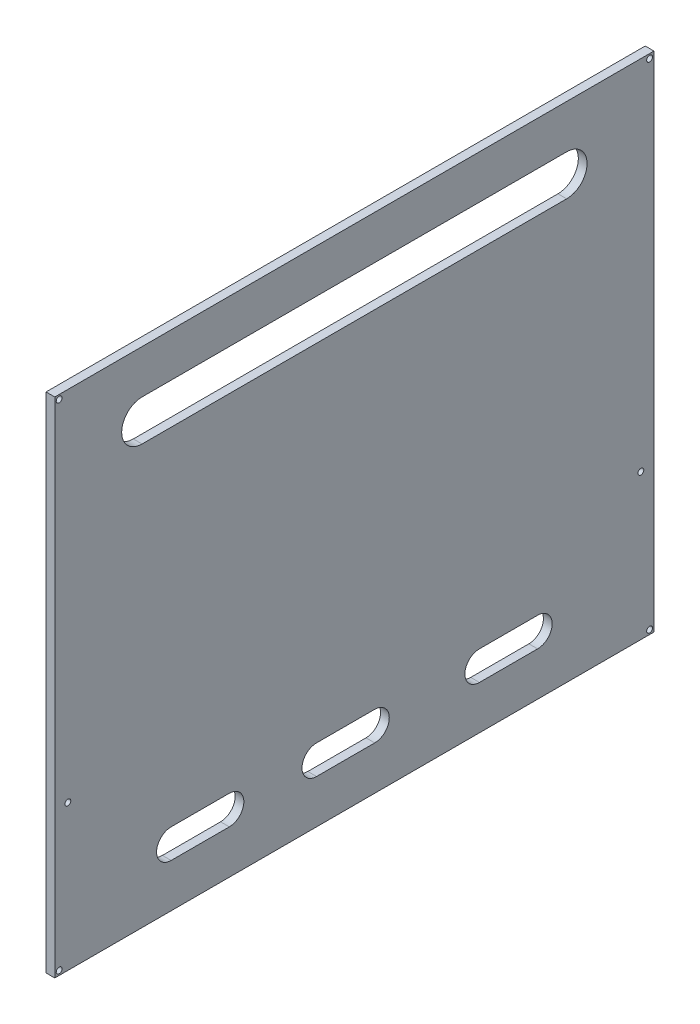
ISO-10303-21;
HEADER;
FILE_DESCRIPTION(('STEP AP214'),'2;1');
FILE_NAME('part.step','',(''),(''),'','','');
FILE_SCHEMA(('AUTOMOTIVE_DESIGN { 1 0 10303 214 1 1 1 1 }'));
ENDSEC;
DATA;
#1=APPLICATION_CONTEXT('core data for automotive mechanical design processes');
#2=APPLICATION_PROTOCOL_DEFINITION('international standard','automotive_design',2000,#1);
#3=PRODUCT_CONTEXT('',#1,'mechanical');
#4=PRODUCT('Part','Part','',(#3));
#5=PRODUCT_RELATED_PRODUCT_CATEGORY('part','',(#4));
#6=PRODUCT_DEFINITION_FORMATION('','',#4);
#7=PRODUCT_DEFINITION_CONTEXT('part definition',#1,'design');
#8=PRODUCT_DEFINITION('design','',#6,#7);
#9=PRODUCT_DEFINITION_SHAPE('','',#8);
#10=(LENGTH_UNIT() NAMED_UNIT(*) SI_UNIT(.MILLI.,.METRE.));
#11=(NAMED_UNIT(*) PLANE_ANGLE_UNIT() SI_UNIT($,.RADIAN.));
#12=(NAMED_UNIT(*) SI_UNIT($,.STERADIAN.) SOLID_ANGLE_UNIT());
#13=UNCERTAINTY_MEASURE_WITH_UNIT(LENGTH_MEASURE(1.E-05),#10,'distance_accuracy_value','');
#14=(GEOMETRIC_REPRESENTATION_CONTEXT(3) GLOBAL_UNCERTAINTY_ASSIGNED_CONTEXT((#13)) GLOBAL_UNIT_ASSIGNED_CONTEXT((#10,
#11,#12)) REPRESENTATION_CONTEXT('',''));
#15=CARTESIAN_POINT('',(0.,0.,0.));
#16=DIRECTION('',(0.,0.,1.));
#17=DIRECTION('',(1.,0.,0.));
#18=AXIS2_PLACEMENT_3D('',#15,#16,#17);
#19=CARTESIAN_POINT('',(3.,0.,0.));
#20=DIRECTION('',(-1.,0.,0.));
#21=DIRECTION('',(0.,0.,1.));
#22=AXIS2_PLACEMENT_3D('',#19,#20,#21);
#23=PLANE('',#22);
#24=CARTESIAN_POINT('',(3.,20.,-90.));
#25=DIRECTION('',(1.,0.,0.));
#26=DIRECTION('',(0.,0.,-1.));
#27=AXIS2_PLACEMENT_3D('',#24,#25,#26);
#28=CIRCLE('',#27,5.);
#29=CARTESIAN_POINT('',(3.,25.,-90.));
#30=VERTEX_POINT('',#29);
#31=CARTESIAN_POINT('',(3.,15.,-90.));
#32=VERTEX_POINT('',#31);
#33=EDGE_CURVE('E215',#30,#32,#28,.T.);
#34=ORIENTED_EDGE('',*,*,#33,.F.);
#35=DIRECTION('',(0.,0.,1.));
#36=VECTOR('',#35,1.);
#37=CARTESIAN_POINT('',(3.,25.,-90.));
#38=LINE('',#37,#36);
#39=CARTESIAN_POINT('',(3.,25.,-110.));
#40=VERTEX_POINT('',#39);
#41=EDGE_CURVE('E223',#40,#30,#38,.T.);
#42=ORIENTED_EDGE('',*,*,#41,.F.);
#43=CARTESIAN_POINT('',(3.,20.,-110.));
#44=DIRECTION('',(1.,0.,0.));
#45=DIRECTION('',(0.,0.,-1.));
#46=AXIS2_PLACEMENT_3D('',#43,#44,#45);
#47=CIRCLE('',#46,5.);
#48=CARTESIAN_POINT('',(3.,15.,-110.));
#49=VERTEX_POINT('',#48);
#50=EDGE_CURVE('E220',#49,#40,#47,.T.);
#51=ORIENTED_EDGE('',*,*,#50,.F.);
#52=DIRECTION('',(0.,0.,-1.));
#53=VECTOR('',#52,1.);
#54=CARTESIAN_POINT('',(3.,15.,-90.));
#55=LINE('',#54,#53);
#56=EDGE_CURVE('E217',#32,#49,#55,.T.);
#57=ORIENTED_EDGE('',*,*,#56,.F.);
#58=EDGE_LOOP('',(#34,#42,#51,#57));
#59=FACE_BOUND('',#58,.T.);
#60=CARTESIAN_POINT('',(3.,151.,-30.));
#61=DIRECTION('',(1.,0.,0.));
#62=DIRECTION('',(0.,0.,-1.));
#63=AXIS2_PLACEMENT_3D('',#60,#61,#62);
#64=CIRCLE('',#63,7.00000000000001);
#65=CARTESIAN_POINT('',(3.,158.,-30.));
#66=VERTEX_POINT('',#65);
#67=CARTESIAN_POINT('',(3.,144.,-30.));
#68=VERTEX_POINT('',#67);
#69=EDGE_CURVE('E277',#66,#68,#64,.T.);
#70=ORIENTED_EDGE('',*,*,#69,.F.);
#71=DIRECTION('',(0.,0.,1.));
#72=VECTOR('',#71,1.);
#73=CARTESIAN_POINT('',(3.,158.,-30.));
#74=LINE('',#73,#72);
#75=CARTESIAN_POINT('',(3.,158.,-176.));
#76=VERTEX_POINT('',#75);
#77=EDGE_CURVE('E285',#76,#66,#74,.T.);
#78=ORIENTED_EDGE('',*,*,#77,.F.);
#79=CARTESIAN_POINT('',(3.,151.,-176.));
#80=DIRECTION('',(1.,0.,0.));
#81=DIRECTION('',(0.,0.,-1.));
#82=AXIS2_PLACEMENT_3D('',#79,#80,#81);
#83=CIRCLE('',#82,7.00000000000001);
#84=CARTESIAN_POINT('',(3.,144.,-176.));
#85=VERTEX_POINT('',#84);
#86=EDGE_CURVE('E282',#85,#76,#83,.T.);
#87=ORIENTED_EDGE('',*,*,#86,.F.);
#88=DIRECTION('',(0.,0.,-1.));
#89=VECTOR('',#88,1.);
#90=CARTESIAN_POINT('',(3.,144.,-30.));
#91=LINE('',#90,#89);
#92=EDGE_CURVE('E279',#68,#85,#91,.T.);
#93=ORIENTED_EDGE('',*,*,#92,.F.);
#94=EDGE_LOOP('',(#70,#78,#87,#93));
#95=FACE_BOUND('',#94,.T.);
#96=DIRECTION('',(0.,-1.,0.));
#97=VECTOR('',#96,1.);
#98=CARTESIAN_POINT('',(3.,0.,0.));
#99=LINE('',#98,#97);
#100=CARTESIAN_POINT('',(3.,173.,0.));
#101=VERTEX_POINT('',#100);
#102=CARTESIAN_POINT('',(3.,0.,0.));
#103=VERTEX_POINT('',#102);
#104=EDGE_CURVE('E308',#101,#103,#99,.T.);
#105=ORIENTED_EDGE('',*,*,#104,.T.);
#106=DIRECTION('',(0.,0.,-1.));
#107=VECTOR('',#106,1.);
#108=CARTESIAN_POINT('',(3.,0.,0.));
#109=LINE('',#108,#107);
#110=CARTESIAN_POINT('',(3.,0.,-206.));
#111=VERTEX_POINT('',#110);
#112=EDGE_CURVE('E311',#103,#111,#109,.T.);
#113=ORIENTED_EDGE('',*,*,#112,.T.);
#114=DIRECTION('',(0.,1.,0.));
#115=VECTOR('',#114,1.);
#116=CARTESIAN_POINT('',(3.,0.,-206.));
#117=LINE('',#116,#115);
#118=CARTESIAN_POINT('',(3.,173.,-206.));
#119=VERTEX_POINT('',#118);
#120=EDGE_CURVE('E314',#111,#119,#117,.T.);
#121=ORIENTED_EDGE('',*,*,#120,.T.);
#122=DIRECTION('',(0.,0.,1.));
#123=VECTOR('',#122,1.);
#124=CARTESIAN_POINT('',(3.,173.,0.));
#125=LINE('',#124,#123);
#126=EDGE_CURVE('E316',#119,#101,#125,.T.);
#127=ORIENTED_EDGE('',*,*,#126,.T.);
#128=EDGE_LOOP('',(#105,#113,#121,#127));
#129=FACE_BOUND('',#128,.T.);
#130=CARTESIAN_POINT('',(3.,20.,-40.));
#131=DIRECTION('',(1.,0.,0.));
#132=DIRECTION('',(0.,0.,-1.));
#133=AXIS2_PLACEMENT_3D('',#130,#131,#132);
#134=CIRCLE('',#133,5.);
#135=CARTESIAN_POINT('',(3.,25.,-40.));
#136=VERTEX_POINT('',#135);
#137=CARTESIAN_POINT('',(3.,15.,-40.));
#138=VERTEX_POINT('',#137);
#139=EDGE_CURVE('E246',#136,#138,#134,.T.);
#140=ORIENTED_EDGE('',*,*,#139,.F.);
#141=DIRECTION('',(0.,0.,1.));
#142=VECTOR('',#141,1.);
#143=CARTESIAN_POINT('',(3.,25.,-40.));
#144=LINE('',#143,#142);
#145=CARTESIAN_POINT('',(3.,25.,-60.));
#146=VERTEX_POINT('',#145);
#147=EDGE_CURVE('E254',#146,#136,#144,.T.);
#148=ORIENTED_EDGE('',*,*,#147,.F.);
#149=CARTESIAN_POINT('',(3.,20.,-60.));
#150=DIRECTION('',(1.,0.,0.));
#151=DIRECTION('',(0.,0.,-1.));
#152=AXIS2_PLACEMENT_3D('',#149,#150,#151);
#153=CIRCLE('',#152,5.);
#154=CARTESIAN_POINT('',(3.,15.,-60.));
#155=VERTEX_POINT('',#154);
#156=EDGE_CURVE('E251',#155,#146,#153,.T.);
#157=ORIENTED_EDGE('',*,*,#156,.F.);
#158=DIRECTION('',(0.,0.,-1.));
#159=VECTOR('',#158,1.);
#160=CARTESIAN_POINT('',(3.,15.,-40.));
#161=LINE('',#160,#159);
#162=EDGE_CURVE('E248',#138,#155,#161,.T.);
#163=ORIENTED_EDGE('',*,*,#162,.F.);
#164=EDGE_LOOP('',(#140,#148,#157,#163));
#165=FACE_BOUND('',#164,.T.);
#166=CARTESIAN_POINT('',(3.,20.,-146.));
#167=DIRECTION('',(1.,0.,0.));
#168=DIRECTION('',(0.,0.,-1.));
#169=AXIS2_PLACEMENT_3D('',#166,#167,#168);
#170=CIRCLE('',#169,5.);
#171=CARTESIAN_POINT('',(3.,25.,-146.));
#172=VERTEX_POINT('',#171);
#173=CARTESIAN_POINT('',(3.,15.,-146.));
#174=VERTEX_POINT('',#173);
#175=EDGE_CURVE('E176',#172,#174,#170,.T.);
#176=ORIENTED_EDGE('',*,*,#175,.F.);
#177=DIRECTION('',(0.,0.,1.));
#178=VECTOR('',#177,1.);
#179=CARTESIAN_POINT('',(3.,25.,-146.));
#180=LINE('',#179,#178);
#181=CARTESIAN_POINT('',(3.,25.,-166.));
#182=VERTEX_POINT('',#181);
#183=EDGE_CURVE('E199',#182,#172,#180,.T.);
#184=ORIENTED_EDGE('',*,*,#183,.F.);
#185=CARTESIAN_POINT('',(3.,20.,-166.));
#186=DIRECTION('',(1.,0.,0.));
#187=DIRECTION('',(0.,0.,-1.));
#188=AXIS2_PLACEMENT_3D('',#185,#186,#187);
#189=CIRCLE('',#188,5.);
#190=CARTESIAN_POINT('',(3.,15.,-166.));
#191=VERTEX_POINT('',#190);
#192=EDGE_CURVE('E197',#191,#182,#189,.T.);
#193=ORIENTED_EDGE('',*,*,#192,.F.);
#194=DIRECTION('',(0.,0.,-1.));
#195=VECTOR('',#194,1.);
#196=CARTESIAN_POINT('',(3.,15.,-146.));
#197=LINE('',#196,#195);
#198=EDGE_CURVE('E184',#174,#191,#197,.T.);
#199=ORIENTED_EDGE('',*,*,#198,.F.);
#200=EDGE_LOOP('',(#176,#184,#193,#199));
#201=FACE_BOUND('',#200,.T.);
#202=CARTESIAN_POINT('',(3.,171.5,-204.5));
#203=DIRECTION('',(1.,0.,0.));
#204=DIRECTION('',(0.,0.,-1.));
#205=AXIS2_PLACEMENT_3D('',#202,#203,#204);
#206=CIRCLE('',#205,0.999999999999998);
#207=CARTESIAN_POINT('',(3.,171.5,-205.5));
#208=VERTEX_POINT('',#207);
#209=EDGE_CURVE('E205',#208,#208,#206,.T.);
#210=ORIENTED_EDGE('',*,*,#209,.F.);
#211=EDGE_LOOP('',(#210));
#212=FACE_BOUND('',#211,.T.);
#213=CARTESIAN_POINT('',(3.,1.5,-204.5));
#214=DIRECTION('',(1.,0.,0.));
#215=DIRECTION('',(0.,0.,-1.));
#216=AXIS2_PLACEMENT_3D('',#213,#214,#215);
#217=CIRCLE('',#216,0.999999999999998);
#218=CARTESIAN_POINT('',(3.,1.5,-205.5));
#219=VERTEX_POINT('',#218);
#220=EDGE_CURVE('E502',#219,#219,#217,.T.);
#221=ORIENTED_EDGE('',*,*,#220,.F.);
#222=EDGE_LOOP('',(#221));
#223=FACE_BOUND('',#222,.T.);
#224=CARTESIAN_POINT('',(3.,171.5,-1.5));
#225=DIRECTION('',(1.,0.,0.));
#226=DIRECTION('',(0.,0.,-1.));
#227=AXIS2_PLACEMENT_3D('',#224,#225,#226);
#228=CIRCLE('',#227,1.);
#229=CARTESIAN_POINT('',(3.,171.5,-2.5));
#230=VERTEX_POINT('',#229);
#231=EDGE_CURVE('E496',#230,#230,#228,.T.);
#232=ORIENTED_EDGE('',*,*,#231,.F.);
#233=EDGE_LOOP('',(#232));
#234=FACE_BOUND('',#233,.T.);
#235=CARTESIAN_POINT('',(3.,1.5,-1.5));
#236=DIRECTION('',(1.,0.,0.));
#237=DIRECTION('',(0.,0.,-1.));
#238=AXIS2_PLACEMENT_3D('',#235,#236,#237);
#239=CIRCLE('',#238,1.);
#240=CARTESIAN_POINT('',(3.,1.5,-2.5));
#241=VERTEX_POINT('',#240);
#242=EDGE_CURVE('E490',#241,#241,#239,.T.);
#243=ORIENTED_EDGE('',*,*,#242,.F.);
#244=EDGE_LOOP('',(#243));
#245=FACE_BOUND('',#244,.T.);
#246=CARTESIAN_POINT('',(3.,50.,-4.5));
#247=DIRECTION('',(1.,0.,0.));
#248=DIRECTION('',(0.,0.,-1.));
#249=AXIS2_PLACEMENT_3D('',#246,#247,#248);
#250=CIRCLE('',#249,1.);
#251=CARTESIAN_POINT('',(3.,50.,-5.5));
#252=VERTEX_POINT('',#251);
#253=EDGE_CURVE('E484',#252,#252,#250,.T.);
#254=ORIENTED_EDGE('',*,*,#253,.F.);
#255=EDGE_LOOP('',(#254));
#256=FACE_BOUND('',#255,.T.);
#257=CARTESIAN_POINT('',(3.,50.,-201.5));
#258=DIRECTION('',(1.,0.,0.));
#259=DIRECTION('',(0.,0.,-1.));
#260=AXIS2_PLACEMENT_3D('',#257,#258,#259);
#261=CIRCLE('',#260,0.999999999999998);
#262=CARTESIAN_POINT('',(3.,50.,-202.5));
#263=VERTEX_POINT('',#262);
#264=EDGE_CURVE('E475',#263,#263,#261,.T.);
#265=ORIENTED_EDGE('',*,*,#264,.F.);
#266=EDGE_LOOP('',(#265));
#267=FACE_BOUND('',#266,.T.);
#268=ADVANCED_FACE('F39',(#59,#95,#129,#165,#201,#212,#223,#234,#245,#256,#267),#23,.F.);
#269=CARTESIAN_POINT('',(0.,0.,0.));
#270=DIRECTION('',(-1.,0.,0.));
#271=DIRECTION('',(0.,0.,1.));
#272=AXIS2_PLACEMENT_3D('',#269,#270,#271);
#273=PLANE('',#272);
#274=CARTESIAN_POINT('',(0.,50.,-4.5));
#275=DIRECTION('',(1.,0.,0.));
#276=DIRECTION('',(0.,0.,-1.));
#277=AXIS2_PLACEMENT_3D('',#274,#275,#276);
#278=CIRCLE('',#277,1.);
#279=CARTESIAN_POINT('',(0.,50.,-5.5));
#280=VERTEX_POINT('',#279);
#281=EDGE_CURVE('E481',#280,#280,#278,.T.);
#282=ORIENTED_EDGE('',*,*,#281,.T.);
#283=EDGE_LOOP('',(#282));
#284=FACE_BOUND('',#283,.T.);
#285=CARTESIAN_POINT('',(0.,171.5,-1.5));
#286=DIRECTION('',(1.,0.,0.));
#287=DIRECTION('',(0.,0.,-1.));
#288=AXIS2_PLACEMENT_3D('',#285,#286,#287);
#289=CIRCLE('',#288,1.);
#290=CARTESIAN_POINT('',(0.,171.5,-2.5));
#291=VERTEX_POINT('',#290);
#292=EDGE_CURVE('E493',#291,#291,#289,.T.);
#293=ORIENTED_EDGE('',*,*,#292,.T.);
#294=EDGE_LOOP('',(#293));
#295=FACE_BOUND('',#294,.T.);
#296=CARTESIAN_POINT('',(0.,171.5,-204.5));
#297=DIRECTION('',(1.,0.,0.));
#298=DIRECTION('',(0.,0.,-1.));
#299=AXIS2_PLACEMENT_3D('',#296,#297,#298);
#300=CIRCLE('',#299,0.999999999999998);
#301=CARTESIAN_POINT('',(0.,171.5,-205.5));
#302=VERTEX_POINT('',#301);
#303=EDGE_CURVE('E505',#302,#302,#300,.T.);
#304=ORIENTED_EDGE('',*,*,#303,.T.);
#305=EDGE_LOOP('',(#304));
#306=FACE_BOUND('',#305,.T.);
#307=DIRECTION('',(0.,-1.,0.));
#308=VECTOR('',#307,1.);
#309=CARTESIAN_POINT('',(0.,0.,0.));
#310=LINE('',#309,#308);
#311=CARTESIAN_POINT('',(0.,173.,0.));
#312=VERTEX_POINT('',#311);
#313=CARTESIAN_POINT('',(0.,0.,0.));
#314=VERTEX_POINT('',#313);
#315=EDGE_CURVE('E307',#312,#314,#310,.T.);
#316=ORIENTED_EDGE('',*,*,#315,.F.);
#317=DIRECTION('',(0.,0.,1.));
#318=VECTOR('',#317,1.);
#319=CARTESIAN_POINT('',(0.,173.,0.));
#320=LINE('',#319,#318);
#321=CARTESIAN_POINT('',(0.,173.,-206.));
#322=VERTEX_POINT('',#321);
#323=EDGE_CURVE('E312',#322,#312,#320,.T.);
#324=ORIENTED_EDGE('',*,*,#323,.F.);
#325=DIRECTION('',(0.,1.,0.));
#326=VECTOR('',#325,1.);
#327=CARTESIAN_POINT('',(0.,0.,-206.));
#328=LINE('',#327,#326);
#329=CARTESIAN_POINT('',(0.,0.,-206.));
#330=VERTEX_POINT('',#329);
#331=EDGE_CURVE('E323',#330,#322,#328,.T.);
#332=ORIENTED_EDGE('',*,*,#331,.F.);
#333=DIRECTION('',(0.,0.,-1.));
#334=VECTOR('',#333,1.);
#335=CARTESIAN_POINT('',(0.,0.,0.));
#336=LINE('',#335,#334);
#337=EDGE_CURVE('E321',#314,#330,#336,.T.);
#338=ORIENTED_EDGE('',*,*,#337,.F.);
#339=EDGE_LOOP('',(#316,#324,#332,#338));
#340=FACE_BOUND('',#339,.T.);
#341=DIRECTION('',(0.,0.,1.));
#342=VECTOR('',#341,1.);
#343=CARTESIAN_POINT('',(0.,158.,-30.));
#344=LINE('',#343,#342);
#345=CARTESIAN_POINT('',(0.,158.,-176.));
#346=VERTEX_POINT('',#345);
#347=CARTESIAN_POINT('',(0.,158.,-30.));
#348=VERTEX_POINT('',#347);
#349=EDGE_CURVE('E280',#346,#348,#344,.T.);
#350=ORIENTED_EDGE('',*,*,#349,.T.);
#351=CARTESIAN_POINT('',(0.,151.,-30.));
#352=DIRECTION('',(1.,0.,0.));
#353=DIRECTION('',(0.,0.,-1.));
#354=AXIS2_PLACEMENT_3D('',#351,#352,#353);
#355=CIRCLE('',#354,7.00000000000001);
#356=CARTESIAN_POINT('',(0.,144.,-30.));
#357=VERTEX_POINT('',#356);
#358=EDGE_CURVE('E276',#348,#357,#355,.T.);
#359=ORIENTED_EDGE('',*,*,#358,.T.);
#360=DIRECTION('',(0.,0.,-1.));
#361=VECTOR('',#360,1.);
#362=CARTESIAN_POINT('',(0.,144.,-30.));
#363=LINE('',#362,#361);
#364=CARTESIAN_POINT('',(0.,144.,-176.));
#365=VERTEX_POINT('',#364);
#366=EDGE_CURVE('E290',#357,#365,#363,.T.);
#367=ORIENTED_EDGE('',*,*,#366,.T.);
#368=CARTESIAN_POINT('',(0.,151.,-176.));
#369=DIRECTION('',(1.,0.,0.));
#370=DIRECTION('',(0.,0.,-1.));
#371=AXIS2_PLACEMENT_3D('',#368,#369,#370);
#372=CIRCLE('',#371,7.00000000000001);
#373=EDGE_CURVE('E293',#365,#346,#372,.T.);
#374=ORIENTED_EDGE('',*,*,#373,.T.);
#375=EDGE_LOOP('',(#350,#359,#367,#374));
#376=FACE_BOUND('',#375,.T.);
#377=DIRECTION('',(0.,0.,1.));
#378=VECTOR('',#377,1.);
#379=CARTESIAN_POINT('',(0.,25.,-40.));
#380=LINE('',#379,#378);
#381=CARTESIAN_POINT('',(0.,25.,-60.));
#382=VERTEX_POINT('',#381);
#383=CARTESIAN_POINT('',(0.,25.,-40.));
#384=VERTEX_POINT('',#383);
#385=EDGE_CURVE('E249',#382,#384,#380,.T.);
#386=ORIENTED_EDGE('',*,*,#385,.T.);
#387=CARTESIAN_POINT('',(0.,20.,-40.));
#388=DIRECTION('',(1.,0.,0.));
#389=DIRECTION('',(0.,0.,-1.));
#390=AXIS2_PLACEMENT_3D('',#387,#388,#389);
#391=CIRCLE('',#390,5.);
#392=CARTESIAN_POINT('',(0.,15.,-40.));
#393=VERTEX_POINT('',#392);
#394=EDGE_CURVE('E245',#384,#393,#391,.T.);
#395=ORIENTED_EDGE('',*,*,#394,.T.);
#396=DIRECTION('',(0.,0.,-1.));
#397=VECTOR('',#396,1.);
#398=CARTESIAN_POINT('',(0.,15.,-40.));
#399=LINE('',#398,#397);
#400=CARTESIAN_POINT('',(0.,15.,-60.));
#401=VERTEX_POINT('',#400);
#402=EDGE_CURVE('E259',#393,#401,#399,.T.);
#403=ORIENTED_EDGE('',*,*,#402,.T.);
#404=CARTESIAN_POINT('',(0.,20.,-60.));
#405=DIRECTION('',(1.,0.,0.));
#406=DIRECTION('',(0.,0.,-1.));
#407=AXIS2_PLACEMENT_3D('',#404,#405,#406);
#408=CIRCLE('',#407,5.);
#409=EDGE_CURVE('E262',#401,#382,#408,.T.);
#410=ORIENTED_EDGE('',*,*,#409,.T.);
#411=EDGE_LOOP('',(#386,#395,#403,#410));
#412=FACE_BOUND('',#411,.T.);
#413=DIRECTION('',(0.,0.,1.));
#414=VECTOR('',#413,1.);
#415=CARTESIAN_POINT('',(0.,25.,-90.));
#416=LINE('',#415,#414);
#417=CARTESIAN_POINT('',(0.,25.,-110.));
#418=VERTEX_POINT('',#417);
#419=CARTESIAN_POINT('',(0.,25.,-90.));
#420=VERTEX_POINT('',#419);
#421=EDGE_CURVE('E218',#418,#420,#416,.T.);
#422=ORIENTED_EDGE('',*,*,#421,.T.);
#423=CARTESIAN_POINT('',(0.,20.,-90.));
#424=DIRECTION('',(1.,0.,0.));
#425=DIRECTION('',(0.,0.,-1.));
#426=AXIS2_PLACEMENT_3D('',#423,#424,#425);
#427=CIRCLE('',#426,5.);
#428=CARTESIAN_POINT('',(0.,15.,-90.));
#429=VERTEX_POINT('',#428);
#430=EDGE_CURVE('E192',#420,#429,#427,.T.);
#431=ORIENTED_EDGE('',*,*,#430,.T.);
#432=DIRECTION('',(0.,0.,-1.));
#433=VECTOR('',#432,1.);
#434=CARTESIAN_POINT('',(0.,15.,-90.));
#435=LINE('',#434,#433);
#436=CARTESIAN_POINT('',(0.,15.,-110.));
#437=VERTEX_POINT('',#436);
#438=EDGE_CURVE('E228',#429,#437,#435,.T.);
#439=ORIENTED_EDGE('',*,*,#438,.T.);
#440=CARTESIAN_POINT('',(0.,20.,-110.));
#441=DIRECTION('',(1.,0.,0.));
#442=DIRECTION('',(0.,0.,-1.));
#443=AXIS2_PLACEMENT_3D('',#440,#441,#442);
#444=CIRCLE('',#443,5.);
#445=EDGE_CURVE('E231',#437,#418,#444,.T.);
#446=ORIENTED_EDGE('',*,*,#445,.T.);
#447=EDGE_LOOP('',(#422,#431,#439,#446));
#448=FACE_BOUND('',#447,.T.);
#449=DIRECTION('',(0.,0.,1.));
#450=VECTOR('',#449,1.);
#451=CARTESIAN_POINT('',(0.,25.,-146.));
#452=LINE('',#451,#450);
#453=CARTESIAN_POINT('',(0.,25.,-166.));
#454=VERTEX_POINT('',#453);
#455=CARTESIAN_POINT('',(0.,25.,-146.));
#456=VERTEX_POINT('',#455);
#457=EDGE_CURVE('E185',#454,#456,#452,.T.);
#458=ORIENTED_EDGE('',*,*,#457,.T.);
#459=CARTESIAN_POINT('',(0.,20.,-146.));
#460=DIRECTION('',(1.,0.,0.));
#461=DIRECTION('',(0.,0.,-1.));
#462=AXIS2_PLACEMENT_3D('',#459,#460,#461);
#463=CIRCLE('',#462,5.);
#464=CARTESIAN_POINT('',(0.,15.,-146.));
#465=VERTEX_POINT('',#464);
#466=EDGE_CURVE('E62',#456,#465,#463,.T.);
#467=ORIENTED_EDGE('',*,*,#466,.T.);
#468=DIRECTION('',(0.,0.,-1.));
#469=VECTOR('',#468,1.);
#470=CARTESIAN_POINT('',(0.,15.,-146.));
#471=LINE('',#470,#469);
#472=CARTESIAN_POINT('',(0.,15.,-166.));
#473=VERTEX_POINT('',#472);
#474=EDGE_CURVE('E191',#465,#473,#471,.T.);
#475=ORIENTED_EDGE('',*,*,#474,.T.);
#476=CARTESIAN_POINT('',(0.,20.,-166.));
#477=DIRECTION('',(1.,0.,0.));
#478=DIRECTION('',(0.,0.,-1.));
#479=AXIS2_PLACEMENT_3D('',#476,#477,#478);
#480=CIRCLE('',#479,5.);
#481=EDGE_CURVE('E207',#473,#454,#480,.T.);
#482=ORIENTED_EDGE('',*,*,#481,.T.);
#483=EDGE_LOOP('',(#458,#467,#475,#482));
#484=FACE_BOUND('',#483,.T.);
#485=CARTESIAN_POINT('',(0.,1.5,-204.5));
#486=DIRECTION('',(1.,0.,0.));
#487=DIRECTION('',(0.,0.,-1.));
#488=AXIS2_PLACEMENT_3D('',#485,#486,#487);
#489=CIRCLE('',#488,0.999999999999998);
#490=CARTESIAN_POINT('',(0.,1.5,-205.5));
#491=VERTEX_POINT('',#490);
#492=EDGE_CURVE('E499',#491,#491,#489,.T.);
#493=ORIENTED_EDGE('',*,*,#492,.T.);
#494=EDGE_LOOP('',(#493));
#495=FACE_BOUND('',#494,.T.);
#496=CARTESIAN_POINT('',(0.,1.5,-1.5));
#497=DIRECTION('',(1.,0.,0.));
#498=DIRECTION('',(0.,0.,-1.));
#499=AXIS2_PLACEMENT_3D('',#496,#497,#498);
#500=CIRCLE('',#499,1.);
#501=CARTESIAN_POINT('',(0.,1.5,-2.5));
#502=VERTEX_POINT('',#501);
#503=EDGE_CURVE('E487',#502,#502,#500,.T.);
#504=ORIENTED_EDGE('',*,*,#503,.T.);
#505=EDGE_LOOP('',(#504));
#506=FACE_BOUND('',#505,.T.);
#507=CARTESIAN_POINT('',(0.,50.,-201.5));
#508=DIRECTION('',(1.,0.,0.));
#509=DIRECTION('',(0.,0.,-1.));
#510=AXIS2_PLACEMENT_3D('',#507,#508,#509);
#511=CIRCLE('',#510,0.999999999999998);
#512=CARTESIAN_POINT('',(0.,50.,-202.5));
#513=VERTEX_POINT('',#512);
#514=EDGE_CURVE('E478',#513,#513,#511,.T.);
#515=ORIENTED_EDGE('',*,*,#514,.T.);
#516=EDGE_LOOP('',(#515));
#517=FACE_BOUND('',#516,.T.);
#518=ADVANCED_FACE('F341',(#284,#295,#306,#340,#376,#412,#448,#484,#495,#506,#517),#273,.T.);
#519=CARTESIAN_POINT('',(3.,0.,0.));
#520=DIRECTION('',(0.,0.,-1.));
#521=DIRECTION('',(-1.,0.,0.));
#522=AXIS2_PLACEMENT_3D('',#519,#520,#521);
#523=PLANE('',#522);
#524=ORIENTED_EDGE('',*,*,#315,.T.);
#525=DIRECTION('',(-1.,0.,0.));
#526=VECTOR('',#525,1.);
#527=CARTESIAN_POINT('',(3.,0.,0.));
#528=LINE('',#527,#526);
#529=EDGE_CURVE('E11',#103,#314,#528,.T.);
#530=ORIENTED_EDGE('',*,*,#529,.F.);
#531=ORIENTED_EDGE('',*,*,#104,.F.);
#532=DIRECTION('',(-1.,0.,0.));
#533=VECTOR('',#532,1.);
#534=CARTESIAN_POINT('',(3.,173.,0.));
#535=LINE('',#534,#533);
#536=EDGE_CURVE('E318',#101,#312,#535,.T.);
#537=ORIENTED_EDGE('',*,*,#536,.T.);
#538=EDGE_LOOP('',(#524,#530,#531,#537));
#539=FACE_BOUND('',#538,.T.);
#540=ADVANCED_FACE('F41',(#539),#523,.F.);
#541=CARTESIAN_POINT('',(3.,0.,0.));
#542=DIRECTION('',(0.,1.,0.));
#543=DIRECTION('',(0.,0.,1.));
#544=AXIS2_PLACEMENT_3D('',#541,#542,#543);
#545=PLANE('',#544);
#546=ORIENTED_EDGE('',*,*,#337,.T.);
#547=DIRECTION('',(-1.,0.,0.));
#548=VECTOR('',#547,1.);
#549=CARTESIAN_POINT('',(3.,0.,-206.));
#550=LINE('',#549,#548);
#551=EDGE_CURVE('E47',#111,#330,#550,.T.);
#552=ORIENTED_EDGE('',*,*,#551,.F.);
#553=ORIENTED_EDGE('',*,*,#112,.F.);
#554=ORIENTED_EDGE('',*,*,#529,.T.);
#555=EDGE_LOOP('',(#546,#552,#553,#554));
#556=FACE_BOUND('',#555,.T.);
#557=ADVANCED_FACE('F352',(#556),#545,.F.);
#558=CARTESIAN_POINT('',(3.,0.,-206.));
#559=DIRECTION('',(0.,0.,1.));
#560=DIRECTION('',(1.,0.,0.));
#561=AXIS2_PLACEMENT_3D('',#558,#559,#560);
#562=PLANE('',#561);
#563=ORIENTED_EDGE('',*,*,#331,.T.);
#564=DIRECTION('',(-1.,0.,0.));
#565=VECTOR('',#564,1.);
#566=CARTESIAN_POINT('',(3.,173.,-206.));
#567=LINE('',#566,#565);
#568=EDGE_CURVE('E328',#119,#322,#567,.T.);
#569=ORIENTED_EDGE('',*,*,#568,.F.);
#570=ORIENTED_EDGE('',*,*,#120,.F.);
#571=ORIENTED_EDGE('',*,*,#551,.T.);
#572=EDGE_LOOP('',(#563,#569,#570,#571));
#573=FACE_BOUND('',#572,.T.);
#574=ADVANCED_FACE('F335',(#573),#562,.F.);
#575=CARTESIAN_POINT('',(3.,173.,0.));
#576=DIRECTION('',(0.,-1.,0.));
#577=DIRECTION('',(0.,0.,-1.));
#578=AXIS2_PLACEMENT_3D('',#575,#576,#577);
#579=PLANE('',#578);
#580=ORIENTED_EDGE('',*,*,#323,.T.);
#581=ORIENTED_EDGE('',*,*,#536,.F.);
#582=ORIENTED_EDGE('',*,*,#126,.F.);
#583=ORIENTED_EDGE('',*,*,#568,.T.);
#584=EDGE_LOOP('',(#580,#581,#582,#583));
#585=FACE_BOUND('',#584,.T.);
#586=ADVANCED_FACE('F345',(#585),#579,.F.);
#587=CARTESIAN_POINT('',(3.,151.,-30.));
#588=DIRECTION('',(-1.,0.,0.));
#589=DIRECTION('',(0.,0.,1.));
#590=AXIS2_PLACEMENT_3D('',#587,#588,#589);
#591=CYLINDRICAL_SURFACE('',#590,7.00000000000001);
#592=ORIENTED_EDGE('',*,*,#358,.F.);
#593=DIRECTION('',(-1.,0.,0.));
#594=VECTOR('',#593,1.);
#595=CARTESIAN_POINT('',(3.,158.,-30.));
#596=LINE('',#595,#594);
#597=EDGE_CURVE('E287',#66,#348,#596,.T.);
#598=ORIENTED_EDGE('',*,*,#597,.F.);
#599=ORIENTED_EDGE('',*,*,#69,.T.);
#600=DIRECTION('',(-1.,0.,0.));
#601=VECTOR('',#600,1.);
#602=CARTESIAN_POINT('',(3.,144.,-30.));
#603=LINE('',#602,#601);
#604=EDGE_CURVE('E304',#68,#357,#603,.T.);
#605=ORIENTED_EDGE('',*,*,#604,.T.);
#606=EDGE_LOOP('',(#592,#598,#599,#605));
#607=FACE_BOUND('',#606,.T.);
#608=ADVANCED_FACE('F370',(#607),#591,.F.);
#609=CARTESIAN_POINT('',(3.,144.,-30.));
#610=DIRECTION('',(0.,1.,0.));
#611=DIRECTION('',(0.,0.,1.));
#612=AXIS2_PLACEMENT_3D('',#609,#610,#611);
#613=PLANE('',#612);
#614=ORIENTED_EDGE('',*,*,#366,.F.);
#615=ORIENTED_EDGE('',*,*,#604,.F.);
#616=ORIENTED_EDGE('',*,*,#92,.T.);
#617=DIRECTION('',(-1.,0.,0.));
#618=VECTOR('',#617,1.);
#619=CARTESIAN_POINT('',(3.,144.,-176.));
#620=LINE('',#619,#618);
#621=EDGE_CURVE('E302',#85,#365,#620,.T.);
#622=ORIENTED_EDGE('',*,*,#621,.T.);
#623=EDGE_LOOP('',(#614,#615,#616,#622));
#624=FACE_BOUND('',#623,.T.);
#625=ADVANCED_FACE('F377',(#624),#613,.T.);
#626=CARTESIAN_POINT('',(3.,151.,-176.));
#627=DIRECTION('',(-1.,0.,0.));
#628=DIRECTION('',(0.,0.,1.));
#629=AXIS2_PLACEMENT_3D('',#626,#627,#628);
#630=CYLINDRICAL_SURFACE('',#629,7.00000000000001);
#631=ORIENTED_EDGE('',*,*,#373,.F.);
#632=ORIENTED_EDGE('',*,*,#621,.F.);
#633=ORIENTED_EDGE('',*,*,#86,.T.);
#634=DIRECTION('',(-1.,0.,0.));
#635=VECTOR('',#634,1.);
#636=CARTESIAN_POINT('',(3.,158.,-176.));
#637=LINE('',#636,#635);
#638=EDGE_CURVE('E300',#76,#346,#637,.T.);
#639=ORIENTED_EDGE('',*,*,#638,.T.);
#640=EDGE_LOOP('',(#631,#632,#633,#639));
#641=FACE_BOUND('',#640,.T.);
#642=ADVANCED_FACE('F382',(#641),#630,.F.);
#643=CARTESIAN_POINT('',(3.,158.,-30.));
#644=DIRECTION('',(0.,-1.,0.));
#645=DIRECTION('',(0.,0.,-1.));
#646=AXIS2_PLACEMENT_3D('',#643,#644,#645);
#647=PLANE('',#646);
#648=ORIENTED_EDGE('',*,*,#349,.F.);
#649=ORIENTED_EDGE('',*,*,#638,.F.);
#650=ORIENTED_EDGE('',*,*,#77,.T.);
#651=ORIENTED_EDGE('',*,*,#597,.T.);
#652=EDGE_LOOP('',(#648,#649,#650,#651));
#653=FACE_BOUND('',#652,.T.);
#654=ADVANCED_FACE('F389',(#653),#647,.T.);
#655=CARTESIAN_POINT('',(3.,20.,-40.));
#656=DIRECTION('',(-1.,0.,0.));
#657=DIRECTION('',(0.,0.,1.));
#658=AXIS2_PLACEMENT_3D('',#655,#656,#657);
#659=CYLINDRICAL_SURFACE('',#658,5.);
#660=ORIENTED_EDGE('',*,*,#394,.F.);
#661=DIRECTION('',(-1.,0.,0.));
#662=VECTOR('',#661,1.);
#663=CARTESIAN_POINT('',(3.,25.,-40.));
#664=LINE('',#663,#662);
#665=EDGE_CURVE('E256',#136,#384,#664,.T.);
#666=ORIENTED_EDGE('',*,*,#665,.F.);
#667=ORIENTED_EDGE('',*,*,#139,.T.);
#668=DIRECTION('',(-1.,0.,0.));
#669=VECTOR('',#668,1.);
#670=CARTESIAN_POINT('',(3.,15.,-40.));
#671=LINE('',#670,#669);
#672=EDGE_CURVE('E273',#138,#393,#671,.T.);
#673=ORIENTED_EDGE('',*,*,#672,.T.);
#674=EDGE_LOOP('',(#660,#666,#667,#673));
#675=FACE_BOUND('',#674,.T.);
#676=ADVANCED_FACE('F402',(#675),#659,.F.);
#677=CARTESIAN_POINT('',(3.,15.,-40.));
#678=DIRECTION('',(0.,1.,0.));
#679=DIRECTION('',(0.,0.,1.));
#680=AXIS2_PLACEMENT_3D('',#677,#678,#679);
#681=PLANE('',#680);
#682=ORIENTED_EDGE('',*,*,#402,.F.);
#683=ORIENTED_EDGE('',*,*,#672,.F.);
#684=ORIENTED_EDGE('',*,*,#162,.T.);
#685=DIRECTION('',(-1.,0.,0.));
#686=VECTOR('',#685,1.);
#687=CARTESIAN_POINT('',(3.,15.,-60.));
#688=LINE('',#687,#686);
#689=EDGE_CURVE('E271',#155,#401,#688,.T.);
#690=ORIENTED_EDGE('',*,*,#689,.T.);
#691=EDGE_LOOP('',(#682,#683,#684,#690));
#692=FACE_BOUND('',#691,.T.);
#693=ADVANCED_FACE('F407',(#692),#681,.T.);
#694=CARTESIAN_POINT('',(3.,20.,-60.));
#695=DIRECTION('',(-1.,0.,0.));
#696=DIRECTION('',(0.,0.,1.));
#697=AXIS2_PLACEMENT_3D('',#694,#695,#696);
#698=CYLINDRICAL_SURFACE('',#697,5.);
#699=ORIENTED_EDGE('',*,*,#409,.F.);
#700=ORIENTED_EDGE('',*,*,#689,.F.);
#701=ORIENTED_EDGE('',*,*,#156,.T.);
#702=DIRECTION('',(-1.,0.,0.));
#703=VECTOR('',#702,1.);
#704=CARTESIAN_POINT('',(3.,25.,-60.));
#705=LINE('',#704,#703);
#706=EDGE_CURVE('E269',#146,#382,#705,.T.);
#707=ORIENTED_EDGE('',*,*,#706,.T.);
#708=EDGE_LOOP('',(#699,#700,#701,#707));
#709=FACE_BOUND('',#708,.T.);
#710=ADVANCED_FACE('F411',(#709),#698,.F.);
#711=CARTESIAN_POINT('',(3.,25.,-40.));
#712=DIRECTION('',(0.,-1.,0.));
#713=DIRECTION('',(0.,0.,-1.));
#714=AXIS2_PLACEMENT_3D('',#711,#712,#713);
#715=PLANE('',#714);
#716=ORIENTED_EDGE('',*,*,#385,.F.);
#717=ORIENTED_EDGE('',*,*,#706,.F.);
#718=ORIENTED_EDGE('',*,*,#147,.T.);
#719=ORIENTED_EDGE('',*,*,#665,.T.);
#720=EDGE_LOOP('',(#716,#717,#718,#719));
#721=FACE_BOUND('',#720,.T.);
#722=ADVANCED_FACE('F415',(#721),#715,.T.);
#723=CARTESIAN_POINT('',(3.,20.,-90.));
#724=DIRECTION('',(-1.,0.,0.));
#725=DIRECTION('',(0.,0.,1.));
#726=AXIS2_PLACEMENT_3D('',#723,#724,#725);
#727=CYLINDRICAL_SURFACE('',#726,5.);
#728=ORIENTED_EDGE('',*,*,#430,.F.);
#729=DIRECTION('',(-1.,0.,0.));
#730=VECTOR('',#729,1.);
#731=CARTESIAN_POINT('',(3.,25.,-90.));
#732=LINE('',#731,#730);
#733=EDGE_CURVE('E225',#30,#420,#732,.T.);
#734=ORIENTED_EDGE('',*,*,#733,.F.);
#735=ORIENTED_EDGE('',*,*,#33,.T.);
#736=DIRECTION('',(-1.,0.,0.));
#737=VECTOR('',#736,1.);
#738=CARTESIAN_POINT('',(3.,15.,-90.));
#739=LINE('',#738,#737);
#740=EDGE_CURVE('E242',#32,#429,#739,.T.);
#741=ORIENTED_EDGE('',*,*,#740,.T.);
#742=EDGE_LOOP('',(#728,#734,#735,#741));
#743=FACE_BOUND('',#742,.T.);
#744=ADVANCED_FACE('F419',(#743),#727,.F.);
#745=CARTESIAN_POINT('',(3.,15.,-90.));
#746=DIRECTION('',(0.,1.,0.));
#747=DIRECTION('',(0.,0.,1.));
#748=AXIS2_PLACEMENT_3D('',#745,#746,#747);
#749=PLANE('',#748);
#750=ORIENTED_EDGE('',*,*,#438,.F.);
#751=ORIENTED_EDGE('',*,*,#740,.F.);
#752=ORIENTED_EDGE('',*,*,#56,.T.);
#753=DIRECTION('',(-1.,0.,0.));
#754=VECTOR('',#753,1.);
#755=CARTESIAN_POINT('',(3.,15.,-110.));
#756=LINE('',#755,#754);
#757=EDGE_CURVE('E240',#49,#437,#756,.T.);
#758=ORIENTED_EDGE('',*,*,#757,.T.);
#759=EDGE_LOOP('',(#750,#751,#752,#758));
#760=FACE_BOUND('',#759,.T.);
#761=ADVANCED_FACE('F423',(#760),#749,.T.);
#762=CARTESIAN_POINT('',(3.,20.,-110.));
#763=DIRECTION('',(-1.,0.,0.));
#764=DIRECTION('',(0.,0.,1.));
#765=AXIS2_PLACEMENT_3D('',#762,#763,#764);
#766=CYLINDRICAL_SURFACE('',#765,5.);
#767=ORIENTED_EDGE('',*,*,#445,.F.);
#768=ORIENTED_EDGE('',*,*,#757,.F.);
#769=ORIENTED_EDGE('',*,*,#50,.T.);
#770=DIRECTION('',(-1.,0.,0.));
#771=VECTOR('',#770,1.);
#772=CARTESIAN_POINT('',(3.,25.,-110.));
#773=LINE('',#772,#771);
#774=EDGE_CURVE('E238',#40,#418,#773,.T.);
#775=ORIENTED_EDGE('',*,*,#774,.T.);
#776=EDGE_LOOP('',(#767,#768,#769,#775));
#777=FACE_BOUND('',#776,.T.);
#778=ADVANCED_FACE('F427',(#777),#766,.F.);
#779=CARTESIAN_POINT('',(3.,25.,-90.));
#780=DIRECTION('',(0.,-1.,0.));
#781=DIRECTION('',(0.,0.,-1.));
#782=AXIS2_PLACEMENT_3D('',#779,#780,#781);
#783=PLANE('',#782);
#784=ORIENTED_EDGE('',*,*,#421,.F.);
#785=ORIENTED_EDGE('',*,*,#774,.F.);
#786=ORIENTED_EDGE('',*,*,#41,.T.);
#787=ORIENTED_EDGE('',*,*,#733,.T.);
#788=EDGE_LOOP('',(#784,#785,#786,#787));
#789=FACE_BOUND('',#788,.T.);
#790=ADVANCED_FACE('F431',(#789),#783,.T.);
#791=CARTESIAN_POINT('',(3.,20.,-146.));
#792=DIRECTION('',(-1.,0.,0.));
#793=DIRECTION('',(0.,0.,1.));
#794=AXIS2_PLACEMENT_3D('',#791,#792,#793);
#795=CYLINDRICAL_SURFACE('',#794,5.);
#796=ORIENTED_EDGE('',*,*,#466,.F.);
#797=DIRECTION('',(-1.,0.,0.));
#798=VECTOR('',#797,1.);
#799=CARTESIAN_POINT('',(3.,25.,-146.));
#800=LINE('',#799,#798);
#801=EDGE_CURVE('E180',#172,#456,#800,.T.);
#802=ORIENTED_EDGE('',*,*,#801,.F.);
#803=ORIENTED_EDGE('',*,*,#175,.T.);
#804=DIRECTION('',(-1.,0.,0.));
#805=VECTOR('',#804,1.);
#806=CARTESIAN_POINT('',(3.,15.,-146.));
#807=LINE('',#806,#805);
#808=EDGE_CURVE('E179',#174,#465,#807,.T.);
#809=ORIENTED_EDGE('',*,*,#808,.T.);
#810=EDGE_LOOP('',(#796,#802,#803,#809));
#811=FACE_BOUND('',#810,.T.);
#812=ADVANCED_FACE('F178',(#811),#795,.F.);
#813=CARTESIAN_POINT('',(3.,15.,-146.));
#814=DIRECTION('',(0.,1.,0.));
#815=DIRECTION('',(0.,0.,1.));
#816=AXIS2_PLACEMENT_3D('',#813,#814,#815);
#817=PLANE('',#816);
#818=ORIENTED_EDGE('',*,*,#474,.F.);
#819=ORIENTED_EDGE('',*,*,#808,.F.);
#820=ORIENTED_EDGE('',*,*,#198,.T.);
#821=DIRECTION('',(-1.,0.,0.));
#822=VECTOR('',#821,1.);
#823=CARTESIAN_POINT('',(3.,15.,-166.));
#824=LINE('',#823,#822);
#825=EDGE_CURVE('E193',#191,#473,#824,.T.);
#826=ORIENTED_EDGE('',*,*,#825,.T.);
#827=EDGE_LOOP('',(#818,#819,#820,#826));
#828=FACE_BOUND('',#827,.T.);
#829=ADVANCED_FACE('F188',(#828),#817,.T.);
#830=CARTESIAN_POINT('',(3.,20.,-166.));
#831=DIRECTION('',(-1.,0.,0.));
#832=DIRECTION('',(0.,0.,1.));
#833=AXIS2_PLACEMENT_3D('',#830,#831,#832);
#834=CYLINDRICAL_SURFACE('',#833,5.);
#835=ORIENTED_EDGE('',*,*,#481,.F.);
#836=ORIENTED_EDGE('',*,*,#825,.F.);
#837=ORIENTED_EDGE('',*,*,#192,.T.);
#838=DIRECTION('',(-1.,0.,0.));
#839=VECTOR('',#838,1.);
#840=CARTESIAN_POINT('',(3.,25.,-166.));
#841=LINE('',#840,#839);
#842=EDGE_CURVE('E54',#182,#454,#841,.T.);
#843=ORIENTED_EDGE('',*,*,#842,.T.);
#844=EDGE_LOOP('',(#835,#836,#837,#843));
#845=FACE_BOUND('',#844,.T.);
#846=ADVANCED_FACE('F440',(#845),#834,.F.);
#847=CARTESIAN_POINT('',(3.,25.,-146.));
#848=DIRECTION('',(0.,-1.,0.));
#849=DIRECTION('',(0.,0.,-1.));
#850=AXIS2_PLACEMENT_3D('',#847,#848,#849);
#851=PLANE('',#850);
#852=ORIENTED_EDGE('',*,*,#457,.F.);
#853=ORIENTED_EDGE('',*,*,#842,.F.);
#854=ORIENTED_EDGE('',*,*,#183,.T.);
#855=ORIENTED_EDGE('',*,*,#801,.T.);
#856=EDGE_LOOP('',(#852,#853,#854,#855));
#857=FACE_BOUND('',#856,.T.);
#858=ADVANCED_FACE('F443',(#857),#851,.T.);
#859=CARTESIAN_POINT('',(3.,171.5,-204.5));
#860=DIRECTION('',(-1.,0.,0.));
#861=DIRECTION('',(0.,0.,1.));
#862=AXIS2_PLACEMENT_3D('',#859,#860,#861);
#863=CYLINDRICAL_SURFACE('',#862,0.999999999999998);
#864=ORIENTED_EDGE('',*,*,#209,.T.);
#865=EDGE_LOOP('',(#864));
#866=FACE_BOUND('',#865,.T.);
#867=ORIENTED_EDGE('',*,*,#303,.F.);
#868=EDGE_LOOP('',(#867));
#869=FACE_BOUND('',#868,.T.);
#870=ADVANCED_FACE('F447',(#866,#869),#863,.F.);
#871=CARTESIAN_POINT('',(3.,1.5,-204.5));
#872=DIRECTION('',(-1.,0.,0.));
#873=DIRECTION('',(0.,0.,1.));
#874=AXIS2_PLACEMENT_3D('',#871,#872,#873);
#875=CYLINDRICAL_SURFACE('',#874,0.999999999999998);
#876=ORIENTED_EDGE('',*,*,#220,.T.);
#877=EDGE_LOOP('',(#876));
#878=FACE_BOUND('',#877,.T.);
#879=ORIENTED_EDGE('',*,*,#492,.F.);
#880=EDGE_LOOP('',(#879));
#881=FACE_BOUND('',#880,.T.);
#882=ADVANCED_FACE('F450',(#878,#881),#875,.F.);
#883=CARTESIAN_POINT('',(3.,171.5,-1.5));
#884=DIRECTION('',(-1.,0.,0.));
#885=DIRECTION('',(0.,0.,1.));
#886=AXIS2_PLACEMENT_3D('',#883,#884,#885);
#887=CYLINDRICAL_SURFACE('',#886,1.);
#888=ORIENTED_EDGE('',*,*,#231,.T.);
#889=EDGE_LOOP('',(#888));
#890=FACE_BOUND('',#889,.T.);
#891=ORIENTED_EDGE('',*,*,#292,.F.);
#892=EDGE_LOOP('',(#891));
#893=FACE_BOUND('',#892,.T.);
#894=ADVANCED_FACE('F454',(#890,#893),#887,.F.);
#895=CARTESIAN_POINT('',(3.,1.5,-1.5));
#896=DIRECTION('',(-1.,0.,0.));
#897=DIRECTION('',(0.,0.,1.));
#898=AXIS2_PLACEMENT_3D('',#895,#896,#897);
#899=CYLINDRICAL_SURFACE('',#898,1.);
#900=ORIENTED_EDGE('',*,*,#242,.T.);
#901=EDGE_LOOP('',(#900));
#902=FACE_BOUND('',#901,.T.);
#903=ORIENTED_EDGE('',*,*,#503,.F.);
#904=EDGE_LOOP('',(#903));
#905=FACE_BOUND('',#904,.T.);
#906=ADVANCED_FACE('F458',(#902,#905),#899,.F.);
#907=CARTESIAN_POINT('',(3.,50.,-4.5));
#908=DIRECTION('',(-1.,0.,0.));
#909=DIRECTION('',(0.,0.,1.));
#910=AXIS2_PLACEMENT_3D('',#907,#908,#909);
#911=CYLINDRICAL_SURFACE('',#910,1.);
#912=ORIENTED_EDGE('',*,*,#253,.T.);
#913=EDGE_LOOP('',(#912));
#914=FACE_BOUND('',#913,.T.);
#915=ORIENTED_EDGE('',*,*,#281,.F.);
#916=EDGE_LOOP('',(#915));
#917=FACE_BOUND('',#916,.T.);
#918=ADVANCED_FACE('F462',(#914,#917),#911,.F.);
#919=CARTESIAN_POINT('',(3.,50.,-201.5));
#920=DIRECTION('',(-1.,0.,0.));
#921=DIRECTION('',(0.,0.,1.));
#922=AXIS2_PLACEMENT_3D('',#919,#920,#921);
#923=CYLINDRICAL_SURFACE('',#922,0.999999999999998);
#924=ORIENTED_EDGE('',*,*,#264,.T.);
#925=EDGE_LOOP('',(#924));
#926=FACE_BOUND('',#925,.T.);
#927=ORIENTED_EDGE('',*,*,#514,.F.);
#928=EDGE_LOOP('',(#927));
#929=FACE_BOUND('',#928,.T.);
#930=ADVANCED_FACE('F466',(#926,#929),#923,.F.);
#931=CLOSED_SHELL('',(#268,#518,#540,#557,#574,#586,#608,#625,#642,#654,#676,#693,#710,#722,
#744,#761,#778,#790,#812,#829,#846,#858,#870,#882,#894,#906,#918,#930));
#932=MANIFOLD_SOLID_BREP('B2',#931);
#933=ADVANCED_BREP_SHAPE_REPRESENTATION('',(#18,#932),#14);
#934=SHAPE_DEFINITION_REPRESENTATION(#9,#933);
ENDSEC;
END-ISO-10303-21;
